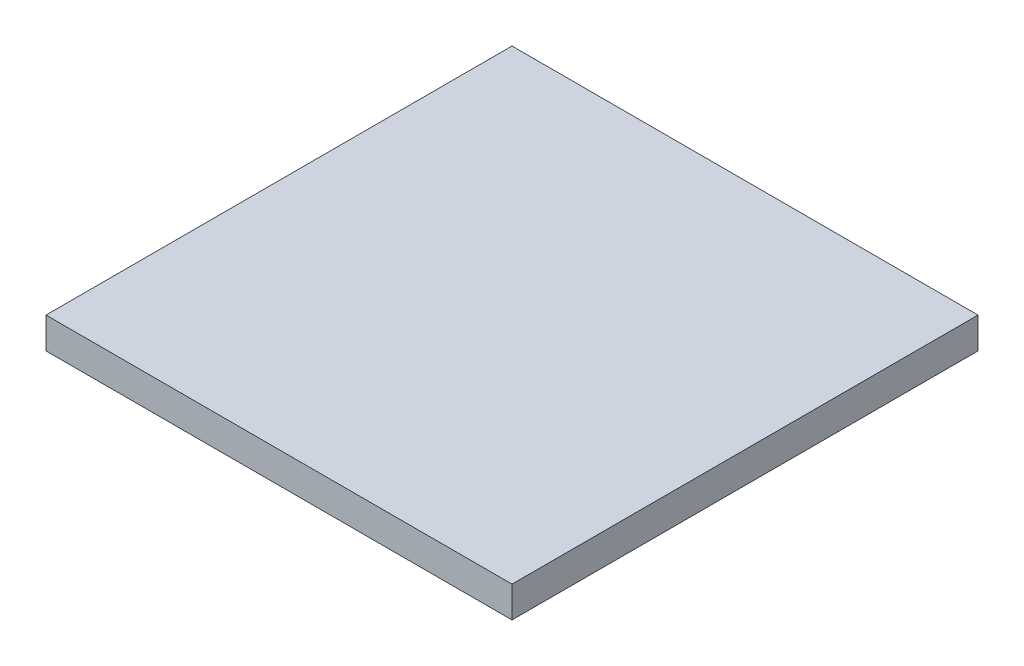
ISO-10303-21;
HEADER;
FILE_DESCRIPTION(('STEP AP214'),'2;1');
FILE_NAME('part.step','',(''),(''),'','','');
FILE_SCHEMA(('AUTOMOTIVE_DESIGN { 1 0 10303 214 1 1 1 1 }'));
ENDSEC;
DATA;
#1=APPLICATION_CONTEXT('core data for automotive mechanical design processes');
#2=APPLICATION_PROTOCOL_DEFINITION('international standard','automotive_design',2000,#1);
#3=PRODUCT_CONTEXT('',#1,'mechanical');
#4=PRODUCT('Part','Part','',(#3));
#5=PRODUCT_RELATED_PRODUCT_CATEGORY('part','',(#4));
#6=PRODUCT_DEFINITION_FORMATION('','',#4);
#7=PRODUCT_DEFINITION_CONTEXT('part definition',#1,'design');
#8=PRODUCT_DEFINITION('design','',#6,#7);
#9=PRODUCT_DEFINITION_SHAPE('','',#8);
#10=(LENGTH_UNIT() NAMED_UNIT(*) SI_UNIT(.MILLI.,.METRE.));
#11=(NAMED_UNIT(*) PLANE_ANGLE_UNIT() SI_UNIT($,.RADIAN.));
#12=(NAMED_UNIT(*) SI_UNIT($,.STERADIAN.) SOLID_ANGLE_UNIT());
#13=UNCERTAINTY_MEASURE_WITH_UNIT(LENGTH_MEASURE(1.E-05),#10,'distance_accuracy_value','');
#14=(GEOMETRIC_REPRESENTATION_CONTEXT(3) GLOBAL_UNCERTAINTY_ASSIGNED_CONTEXT((#13)) GLOBAL_UNIT_ASSIGNED_CONTEXT((#10,
#11,#12)) REPRESENTATION_CONTEXT('',''));
#15=CARTESIAN_POINT('',(0.,0.,0.));
#16=DIRECTION('',(0.,0.,1.));
#17=DIRECTION('',(1.,0.,0.));
#18=AXIS2_PLACEMENT_3D('',#15,#16,#17);
#19=CARTESIAN_POINT('',(-150.,20.,-150.));
#20=DIRECTION('',(0.,0.,-1.));
#21=DIRECTION('',(-1.,0.,0.));
#22=AXIS2_PLACEMENT_3D('',#19,#20,#21);
#23=PLANE('',#22);
#24=DIRECTION('',(1.,0.,0.));
#25=VECTOR('',#24,1.);
#26=CARTESIAN_POINT('',(-150.,0.,-150.));
#27=LINE('',#26,#25);
#28=CARTESIAN_POINT('',(-150.,0.,-150.));
#29=VERTEX_POINT('',#28);
#30=CARTESIAN_POINT('',(150.,0.,-150.));
#31=VERTEX_POINT('',#30);
#32=EDGE_CURVE('E113',#29,#31,#27,.T.);
#33=ORIENTED_EDGE('',*,*,#32,.F.);
#34=DIRECTION('',(0.,-1.,0.));
#35=VECTOR('',#34,1.);
#36=CARTESIAN_POINT('',(-150.,20.,-150.));
#37=LINE('',#36,#35);
#38=CARTESIAN_POINT('',(-150.,20.,-150.));
#39=VERTEX_POINT('',#38);
#40=EDGE_CURVE('E11',#39,#29,#37,.T.);
#41=ORIENTED_EDGE('',*,*,#40,.F.);
#42=DIRECTION('',(1.,0.,0.));
#43=VECTOR('',#42,1.);
#44=CARTESIAN_POINT('',(-150.,20.,-150.));
#45=LINE('',#44,#43);
#46=CARTESIAN_POINT('',(150.,20.,-150.));
#47=VERTEX_POINT('',#46);
#48=EDGE_CURVE('E105',#39,#47,#45,.T.);
#49=ORIENTED_EDGE('',*,*,#48,.T.);
#50=DIRECTION('',(0.,-1.,0.));
#51=VECTOR('',#50,1.);
#52=CARTESIAN_POINT('',(150.,20.,-150.));
#53=LINE('',#52,#51);
#54=EDGE_CURVE('E46',#47,#31,#53,.T.);
#55=ORIENTED_EDGE('',*,*,#54,.T.);
#56=EDGE_LOOP('',(#33,#41,#49,#55));
#57=FACE_BOUND('',#56,.T.);
#58=ADVANCED_FACE('F43',(#57),#23,.T.);
#59=CARTESIAN_POINT('',(-150.,20.,150.));
#60=DIRECTION('',(-1.,0.,0.));
#61=DIRECTION('',(0.,0.,1.));
#62=AXIS2_PLACEMENT_3D('',#59,#60,#61);
#63=PLANE('',#62);
#64=DIRECTION('',(0.,0.,-1.));
#65=VECTOR('',#64,1.);
#66=CARTESIAN_POINT('',(-150.,0.,150.));
#67=LINE('',#66,#65);
#68=CARTESIAN_POINT('',(-150.,0.,150.));
#69=VERTEX_POINT('',#68);
#70=EDGE_CURVE('E108',#69,#29,#67,.T.);
#71=ORIENTED_EDGE('',*,*,#70,.F.);
#72=DIRECTION('',(0.,-1.,0.));
#73=VECTOR('',#72,1.);
#74=CARTESIAN_POINT('',(-150.,20.,150.));
#75=LINE('',#74,#73);
#76=CARTESIAN_POINT('',(-150.,20.,150.));
#77=VERTEX_POINT('',#76);
#78=EDGE_CURVE('E53',#77,#69,#75,.T.);
#79=ORIENTED_EDGE('',*,*,#78,.F.);
#80=DIRECTION('',(0.,0.,-1.));
#81=VECTOR('',#80,1.);
#82=CARTESIAN_POINT('',(-150.,20.,150.));
#83=LINE('',#82,#81);
#84=EDGE_CURVE('E92',#77,#39,#83,.T.);
#85=ORIENTED_EDGE('',*,*,#84,.T.);
#86=ORIENTED_EDGE('',*,*,#40,.T.);
#87=EDGE_LOOP('',(#71,#79,#85,#86));
#88=FACE_BOUND('',#87,.T.);
#89=ADVANCED_FACE('F129',(#88),#63,.T.);
#90=CARTESIAN_POINT('',(-150.,20.,150.));
#91=DIRECTION('',(0.,0.,-1.));
#92=DIRECTION('',(-1.,0.,0.));
#93=AXIS2_PLACEMENT_3D('',#90,#91,#92);
#94=PLANE('',#93);
#95=DIRECTION('',(1.,0.,0.));
#96=VECTOR('',#95,1.);
#97=CARTESIAN_POINT('',(-150.,0.,150.));
#98=LINE('',#97,#96);
#99=CARTESIAN_POINT('',(150.,0.,150.));
#100=VERTEX_POINT('',#99);
#101=EDGE_CURVE('E98',#69,#100,#98,.T.);
#102=ORIENTED_EDGE('',*,*,#101,.T.);
#103=DIRECTION('',(0.,-1.,0.));
#104=VECTOR('',#103,1.);
#105=CARTESIAN_POINT('',(150.,20.,150.));
#106=LINE('',#105,#104);
#107=CARTESIAN_POINT('',(150.,20.,150.));
#108=VERTEX_POINT('',#107);
#109=EDGE_CURVE('E96',#108,#100,#106,.T.);
#110=ORIENTED_EDGE('',*,*,#109,.F.);
#111=DIRECTION('',(1.,0.,0.));
#112=VECTOR('',#111,1.);
#113=CARTESIAN_POINT('',(-150.,20.,150.));
#114=LINE('',#113,#112);
#115=EDGE_CURVE('E89',#77,#108,#114,.T.);
#116=ORIENTED_EDGE('',*,*,#115,.F.);
#117=ORIENTED_EDGE('',*,*,#78,.T.);
#118=EDGE_LOOP('',(#102,#110,#116,#117));
#119=FACE_BOUND('',#118,.T.);
#120=ADVANCED_FACE('F97',(#119),#94,.F.);
#121=CARTESIAN_POINT('',(150.,20.,150.));
#122=DIRECTION('',(-1.,0.,0.));
#123=DIRECTION('',(0.,0.,1.));
#124=AXIS2_PLACEMENT_3D('',#121,#122,#123);
#125=PLANE('',#124);
#126=DIRECTION('',(0.,0.,-1.));
#127=VECTOR('',#126,1.);
#128=CARTESIAN_POINT('',(150.,0.,150.));
#129=LINE('',#128,#127);
#130=EDGE_CURVE('E117',#100,#31,#129,.T.);
#131=ORIENTED_EDGE('',*,*,#130,.T.);
#132=ORIENTED_EDGE('',*,*,#54,.F.);
#133=DIRECTION('',(0.,0.,-1.));
#134=VECTOR('',#133,1.);
#135=CARTESIAN_POINT('',(150.,20.,150.));
#136=LINE('',#135,#134);
#137=EDGE_CURVE('E86',#108,#47,#136,.T.);
#138=ORIENTED_EDGE('',*,*,#137,.F.);
#139=ORIENTED_EDGE('',*,*,#109,.T.);
#140=EDGE_LOOP('',(#131,#132,#138,#139));
#141=FACE_BOUND('',#140,.T.);
#142=ADVANCED_FACE('F103',(#141),#125,.F.);
#143=CARTESIAN_POINT('',(0.,20.,0.));
#144=DIRECTION('',(0.,1.,0.));
#145=DIRECTION('',(0.,0.,1.));
#146=AXIS2_PLACEMENT_3D('',#143,#144,#145);
#147=PLANE('',#146);
#148=ORIENTED_EDGE('',*,*,#48,.F.);
#149=ORIENTED_EDGE('',*,*,#84,.F.);
#150=ORIENTED_EDGE('',*,*,#115,.T.);
#151=ORIENTED_EDGE('',*,*,#137,.T.);
#152=EDGE_LOOP('',(#148,#149,#150,#151));
#153=FACE_BOUND('',#152,.T.);
#154=ADVANCED_FACE('F91',(#153),#147,.T.);
#155=CARTESIAN_POINT('',(0.,0.,0.));
#156=DIRECTION('',(0.,1.,0.));
#157=DIRECTION('',(0.,0.,1.));
#158=AXIS2_PLACEMENT_3D('',#155,#156,#157);
#159=PLANE('',#158);
#160=ORIENTED_EDGE('',*,*,#32,.T.);
#161=ORIENTED_EDGE('',*,*,#130,.F.);
#162=ORIENTED_EDGE('',*,*,#101,.F.);
#163=ORIENTED_EDGE('',*,*,#70,.T.);
#164=EDGE_LOOP('',(#160,#161,#162,#163));
#165=FACE_BOUND('',#164,.T.);
#166=ADVANCED_FACE('F128',(#165),#159,.F.);
#167=CLOSED_SHELL('',(#58,#89,#120,#142,#154,#166));
#168=MANIFOLD_SOLID_BREP('B2',#167);
#169=ADVANCED_BREP_SHAPE_REPRESENTATION('',(#18,#168),#14);
#170=SHAPE_DEFINITION_REPRESENTATION(#9,#169);
ENDSEC;
END-ISO-10303-21;
